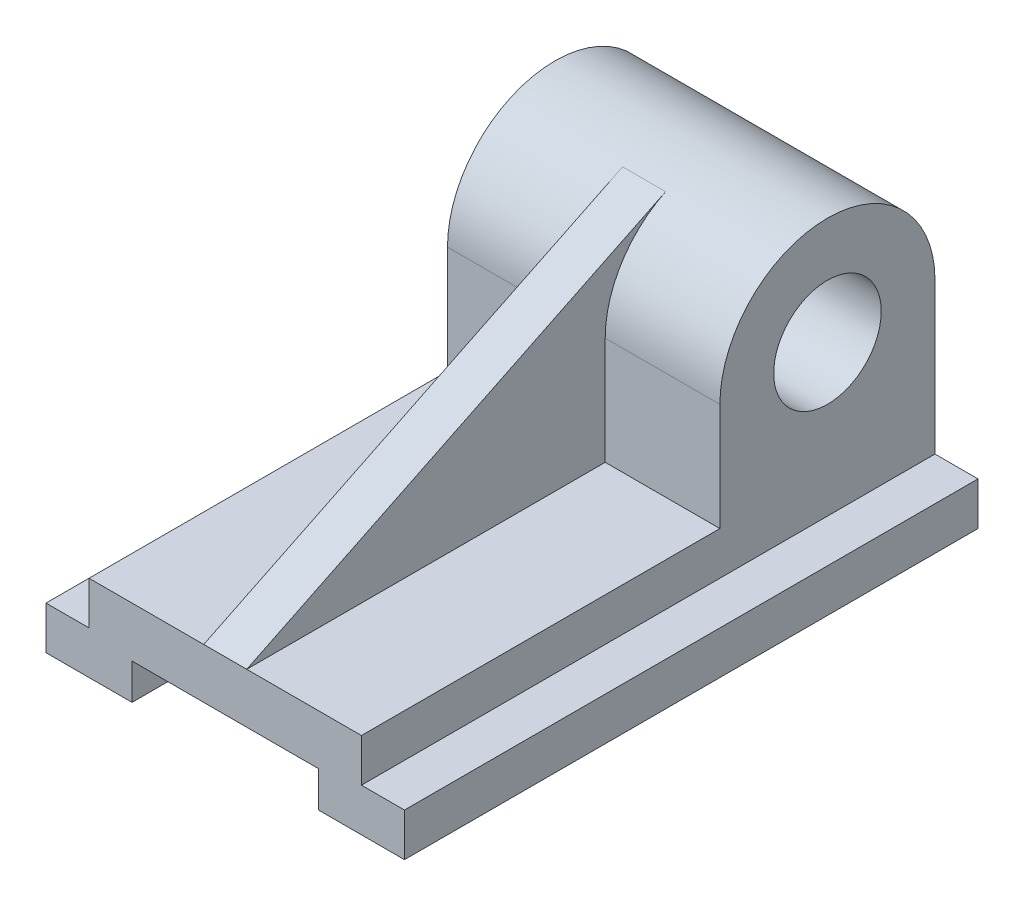
ISO-10303-21;
HEADER;
FILE_DESCRIPTION(('STEP AP214'),'2;1');
FILE_NAME('part.step','',(''),(''),'','','');
FILE_SCHEMA(('AUTOMOTIVE_DESIGN { 1 0 10303 214 1 1 1 1 }'));
ENDSEC;
DATA;
#1=APPLICATION_CONTEXT('core data for automotive mechanical design processes');
#2=APPLICATION_PROTOCOL_DEFINITION('international standard','automotive_design',2000,#1);
#3=PRODUCT_CONTEXT('',#1,'mechanical');
#4=PRODUCT('Part','Part','',(#3));
#5=PRODUCT_RELATED_PRODUCT_CATEGORY('part','',(#4));
#6=PRODUCT_DEFINITION_FORMATION('','',#4);
#7=PRODUCT_DEFINITION_CONTEXT('part definition',#1,'design');
#8=PRODUCT_DEFINITION('design','',#6,#7);
#9=PRODUCT_DEFINITION_SHAPE('','',#8);
#10=(LENGTH_UNIT() NAMED_UNIT(*) SI_UNIT(.MILLI.,.METRE.));
#11=(NAMED_UNIT(*) PLANE_ANGLE_UNIT() SI_UNIT($,.RADIAN.));
#12=(NAMED_UNIT(*) SI_UNIT($,.STERADIAN.) SOLID_ANGLE_UNIT());
#13=UNCERTAINTY_MEASURE_WITH_UNIT(LENGTH_MEASURE(1.E-05),#10,'distance_accuracy_value','');
#14=(GEOMETRIC_REPRESENTATION_CONTEXT(3) GLOBAL_UNCERTAINTY_ASSIGNED_CONTEXT((#13)) GLOBAL_UNIT_ASSIGNED_CONTEXT((#10,
#11,#12)) REPRESENTATION_CONTEXT('',''));
#15=CARTESIAN_POINT('',(0.,0.,0.));
#16=DIRECTION('',(0.,0.,1.));
#17=DIRECTION('',(1.,0.,0.));
#18=AXIS2_PLACEMENT_3D('',#15,#16,#17);
#19=CARTESIAN_POINT('',(-50.,12.,160.));
#20=DIRECTION('',(0.,-1.,0.));
#21=DIRECTION('',(0.,0.,-1.));
#22=AXIS2_PLACEMENT_3D('',#19,#20,#21);
#23=PLANE('',#22);
#24=DIRECTION('',(0.,0.,1.));
#25=VECTOR('',#24,1.);
#26=CARTESIAN_POINT('',(-6.,12.,160.));
#27=LINE('',#26,#25);
#28=CARTESIAN_POINT('',(-6.,12.,60.));
#29=VERTEX_POINT('',#28);
#30=CARTESIAN_POINT('',(-6.,12.,160.));
#31=VERTEX_POINT('',#30);
#32=EDGE_CURVE('E185',#29,#31,#27,.T.);
#33=ORIENTED_EDGE('',*,*,#32,.F.);
#34=DIRECTION('',(1.,0.,0.));
#35=VECTOR('',#34,1.);
#36=CARTESIAN_POINT('',(-38.,12.,60.));
#37=LINE('',#36,#35);
#38=CARTESIAN_POINT('',(-38.,12.,60.));
#39=VERTEX_POINT('',#38);
#40=EDGE_CURVE('E170',#39,#29,#37,.T.);
#41=ORIENTED_EDGE('',*,*,#40,.F.);
#42=DIRECTION('',(0.,0.,1.));
#43=VECTOR('',#42,1.);
#44=CARTESIAN_POINT('',(-38.,12.,0.));
#45=LINE('',#44,#43);
#46=CARTESIAN_POINT('',(-38.,12.,160.));
#47=VERTEX_POINT('',#46);
#48=EDGE_CURVE('E241',#39,#47,#45,.T.);
#49=ORIENTED_EDGE('',*,*,#48,.T.);
#50=DIRECTION('',(-1.,0.,0.));
#51=VECTOR('',#50,1.);
#52=CARTESIAN_POINT('',(-50.,12.,160.));
#53=LINE('',#52,#51);
#54=EDGE_CURVE('E186',#31,#47,#53,.T.);
#55=ORIENTED_EDGE('',*,*,#54,.F.);
#56=EDGE_LOOP('',(#33,#41,#49,#55));
#57=FACE_BOUND('',#56,.T.);
#58=ADVANCED_FACE('F45',(#57),#23,.F.);
#59=CARTESIAN_POINT('',(-38.,72.,60.));
#60=DIRECTION('',(0.,0.,-1.));
#61=DIRECTION('',(-1.,0.,0.));
#62=AXIS2_PLACEMENT_3D('',#59,#60,#61);
#63=PLANE('',#62);
#64=DIRECTION('',(0.,-1.,0.));
#65=VECTOR('',#64,1.);
#66=CARTESIAN_POINT('',(-6.,72.,60.));
#67=LINE('',#66,#65);
#68=CARTESIAN_POINT('',(-6.,42.,60.));
#69=VERTEX_POINT('',#68);
#70=EDGE_CURVE('E174',#69,#29,#67,.T.);
#71=ORIENTED_EDGE('',*,*,#70,.F.);
#72=DIRECTION('',(-1.,0.,0.));
#73=VECTOR('',#72,1.);
#74=CARTESIAN_POINT('',(38.,42.,60.));
#75=LINE('',#74,#73);
#76=CARTESIAN_POINT('',(-38.,42.,60.));
#77=VERTEX_POINT('',#76);
#78=EDGE_CURVE('E346',#69,#77,#75,.T.);
#79=ORIENTED_EDGE('',*,*,#78,.T.);
#80=DIRECTION('',(0.,-1.,0.));
#81=VECTOR('',#80,1.);
#82=CARTESIAN_POINT('',(-38.,72.,60.));
#83=LINE('',#82,#81);
#84=EDGE_CURVE('E176',#77,#39,#83,.T.);
#85=ORIENTED_EDGE('',*,*,#84,.T.);
#86=ORIENTED_EDGE('',*,*,#40,.T.);
#87=EDGE_LOOP('',(#71,#79,#85,#86));
#88=FACE_BOUND('',#87,.T.);
#89=ADVANCED_FACE('F172',(#88),#63,.F.);
#90=CARTESIAN_POINT('',(38.,42.,30.));
#91=DIRECTION('',(1.,0.,0.));
#92=DIRECTION('',(0.,0.,-1.));
#93=AXIS2_PLACEMENT_3D('',#90,#91,#92);
#94=CYLINDRICAL_SURFACE('',#93,30.);
#95=CARTESIAN_POINT('',(38.,42.,30.));
#96=DIRECTION('',(-1.,0.,0.));
#97=DIRECTION('',(0.,0.,1.));
#98=AXIS2_PLACEMENT_3D('',#95,#96,#97);
#99=CIRCLE('',#98,30.);
#100=CARTESIAN_POINT('',(38.,42.,0.));
#101=VERTEX_POINT('',#100);
#102=CARTESIAN_POINT('',(38.,42.,60.));
#103=VERTEX_POINT('',#102);
#104=EDGE_CURVE('E56',#101,#103,#99,.F.);
#105=ORIENTED_EDGE('',*,*,#104,.F.);
#106=DIRECTION('',(-1.,0.,0.));
#107=VECTOR('',#106,1.);
#108=CARTESIAN_POINT('',(38.,42.,0.));
#109=LINE('',#108,#107);
#110=CARTESIAN_POINT('',(-38.,42.,0.));
#111=VERTEX_POINT('',#110);
#112=EDGE_CURVE('E351',#111,#101,#109,.F.);
#113=ORIENTED_EDGE('',*,*,#112,.F.);
#114=CARTESIAN_POINT('',(-38.,42.,30.));
#115=DIRECTION('',(-1.,0.,0.));
#116=DIRECTION('',(0.,0.,1.));
#117=AXIS2_PLACEMENT_3D('',#114,#115,#116);
#118=CIRCLE('',#117,30.);
#119=EDGE_CURVE('E11',#77,#111,#118,.T.);
#120=ORIENTED_EDGE('',*,*,#119,.F.);
#121=ORIENTED_EDGE('',*,*,#78,.F.);
#122=CARTESIAN_POINT('',(-6.,42.,30.));
#123=DIRECTION('',(1.,0.,0.));
#124=DIRECTION('',(0.,0.,-1.));
#125=AXIS2_PLACEMENT_3D('',#122,#123,#124);
#126=CIRCLE('',#125,30.);
#127=CARTESIAN_POINT('',(-6.,68.9662921348059,43.1460674157097));
#128=VERTEX_POINT('',#127);
#129=EDGE_CURVE('E68',#69,#128,#126,.F.);
#130=ORIENTED_EDGE('',*,*,#129,.T.);
#131=DIRECTION('',(1.,0.,0.));
#132=VECTOR('',#131,1.);
#133=CARTESIAN_POINT('',(38.,68.9662921348203,43.1460674157167));
#134=LINE('',#133,#132);
#135=CARTESIAN_POINT('',(6.,68.9662921348059,43.1460674157097));
#136=VERTEX_POINT('',#135);
#137=EDGE_CURVE('E63',#128,#136,#134,.T.);
#138=ORIENTED_EDGE('',*,*,#137,.T.);
#139=CARTESIAN_POINT('',(6.,42.,30.));
#140=DIRECTION('',(1.,0.,0.));
#141=DIRECTION('',(0.,0.,-1.));
#142=AXIS2_PLACEMENT_3D('',#139,#140,#141);
#143=CIRCLE('',#142,30.);
#144=CARTESIAN_POINT('',(6.,42.,60.));
#145=VERTEX_POINT('',#144);
#146=EDGE_CURVE('E211',#145,#136,#143,.F.);
#147=ORIENTED_EDGE('',*,*,#146,.F.);
#148=EDGE_CURVE('E347',#103,#145,#75,.T.);
#149=ORIENTED_EDGE('',*,*,#148,.F.);
#150=EDGE_LOOP('',(#105,#113,#120,#121,#130,#138,#147,#149));
#151=FACE_BOUND('',#150,.T.);
#152=ADVANCED_FACE('F48',(#151),#94,.T.);
#153=CARTESIAN_POINT('',(6.,12.,60.));
#154=VERTEX_POINT('',#153);
#155=CARTESIAN_POINT('',(38.,12.,60.));
#156=VERTEX_POINT('',#155);
#157=EDGE_CURVE('E182',#154,#156,#37,.T.);
#158=ORIENTED_EDGE('',*,*,#157,.F.);
#159=DIRECTION('',(0.,0.,1.));
#160=VECTOR('',#159,1.);
#161=CARTESIAN_POINT('',(6.,12.,160.));
#162=LINE('',#161,#160);
#163=CARTESIAN_POINT('',(6.,12.,160.));
#164=VERTEX_POINT('',#163);
#165=EDGE_CURVE('E208',#154,#164,#162,.T.);
#166=ORIENTED_EDGE('',*,*,#165,.T.);
#167=CARTESIAN_POINT('',(38.,12.,160.));
#168=VERTEX_POINT('',#167);
#169=EDGE_CURVE('E315',#168,#164,#53,.T.);
#170=ORIENTED_EDGE('',*,*,#169,.F.);
#171=DIRECTION('',(0.,0.,1.));
#172=VECTOR('',#171,1.);
#173=CARTESIAN_POINT('',(38.,12.,0.));
#174=LINE('',#173,#172);
#175=EDGE_CURVE('E258',#156,#168,#174,.T.);
#176=ORIENTED_EDGE('',*,*,#175,.F.);
#177=EDGE_LOOP('',(#158,#166,#170,#176));
#178=FACE_BOUND('',#177,.T.);
#179=ADVANCED_FACE('F434',(#178),#23,.F.);
#180=CARTESIAN_POINT('',(0.,0.,160.));
#181=DIRECTION('',(0.,0.,1.));
#182=DIRECTION('',(1.,0.,0.));
#183=AXIS2_PLACEMENT_3D('',#180,#181,#182);
#184=PLANE('',#183);
#185=ORIENTED_EDGE('',*,*,#169,.T.);
#186=EDGE_CURVE('E320',#164,#31,#53,.T.);
#187=ORIENTED_EDGE('',*,*,#186,.T.);
#188=ORIENTED_EDGE('',*,*,#54,.T.);
#189=DIRECTION('',(0.,-1.,0.));
#190=VECTOR('',#189,1.);
#191=CARTESIAN_POINT('',(-38.,12.,160.));
#192=LINE('',#191,#190);
#193=CARTESIAN_POINT('',(-38.,0.,160.));
#194=VERTEX_POINT('',#193);
#195=EDGE_CURVE('E231',#47,#194,#192,.T.);
#196=ORIENTED_EDGE('',*,*,#195,.T.);
#197=DIRECTION('',(1.,0.,0.));
#198=VECTOR('',#197,1.);
#199=CARTESIAN_POINT('',(-50.,0.,160.));
#200=LINE('',#199,#198);
#201=CARTESIAN_POINT('',(-50.,0.,160.));
#202=VERTEX_POINT('',#201);
#203=EDGE_CURVE('E225',#202,#194,#200,.T.);
#204=ORIENTED_EDGE('',*,*,#203,.F.);
#205=DIRECTION('',(0.,-1.,0.));
#206=VECTOR('',#205,1.);
#207=CARTESIAN_POINT('',(-50.,12.,160.));
#208=LINE('',#207,#206);
#209=CARTESIAN_POINT('',(-50.,-12.,160.));
#210=VERTEX_POINT('',#209);
#211=EDGE_CURVE('E319',#202,#210,#208,.T.);
#212=ORIENTED_EDGE('',*,*,#211,.T.);
#213=DIRECTION('',(1.,0.,0.));
#214=VECTOR('',#213,1.);
#215=CARTESIAN_POINT('',(-50.,-12.,160.));
#216=LINE('',#215,#214);
#217=CARTESIAN_POINT('',(-26.,-12.,160.));
#218=VERTEX_POINT('',#217);
#219=EDGE_CURVE('E324',#210,#218,#216,.T.);
#220=ORIENTED_EDGE('',*,*,#219,.T.);
#221=DIRECTION('',(0.,-1.,0.));
#222=VECTOR('',#221,1.);
#223=CARTESIAN_POINT('',(-26.,-12.,160.));
#224=LINE('',#223,#222);
#225=CARTESIAN_POINT('',(-26.,-2.,160.));
#226=VERTEX_POINT('',#225);
#227=EDGE_CURVE('E269',#226,#218,#224,.T.);
#228=ORIENTED_EDGE('',*,*,#227,.F.);
#229=DIRECTION('',(-1.,0.,0.));
#230=VECTOR('',#229,1.);
#231=CARTESIAN_POINT('',(-26.,-2.,160.));
#232=LINE('',#231,#230);
#233=CARTESIAN_POINT('',(26.,-2.,160.));
#234=VERTEX_POINT('',#233);
#235=EDGE_CURVE('E280',#234,#226,#232,.T.);
#236=ORIENTED_EDGE('',*,*,#235,.F.);
#237=DIRECTION('',(0.,1.,0.));
#238=VECTOR('',#237,1.);
#239=CARTESIAN_POINT('',(26.,-12.,160.));
#240=LINE('',#239,#238);
#241=CARTESIAN_POINT('',(26.,-12.,160.));
#242=VERTEX_POINT('',#241);
#243=EDGE_CURVE('E290',#242,#234,#240,.T.);
#244=ORIENTED_EDGE('',*,*,#243,.F.);
#245=CARTESIAN_POINT('',(50.,-12.,160.));
#246=VERTEX_POINT('',#245);
#247=EDGE_CURVE('E323',#242,#246,#216,.T.);
#248=ORIENTED_EDGE('',*,*,#247,.T.);
#249=DIRECTION('',(0.,1.,0.));
#250=VECTOR('',#249,1.);
#251=CARTESIAN_POINT('',(50.,12.,160.));
#252=LINE('',#251,#250);
#253=CARTESIAN_POINT('',(50.,0.,160.));
#254=VERTEX_POINT('',#253);
#255=EDGE_CURVE('E310',#246,#254,#252,.T.);
#256=ORIENTED_EDGE('',*,*,#255,.T.);
#257=DIRECTION('',(-1.,0.,0.));
#258=VECTOR('',#257,1.);
#259=CARTESIAN_POINT('',(50.,0.,160.));
#260=LINE('',#259,#258);
#261=CARTESIAN_POINT('',(38.,0.,160.));
#262=VERTEX_POINT('',#261);
#263=EDGE_CURVE('E254',#254,#262,#260,.T.);
#264=ORIENTED_EDGE('',*,*,#263,.T.);
#265=DIRECTION('',(0.,-1.,0.));
#266=VECTOR('',#265,1.);
#267=CARTESIAN_POINT('',(38.,12.,160.));
#268=LINE('',#267,#266);
#269=EDGE_CURVE('E244',#168,#262,#268,.T.);
#270=ORIENTED_EDGE('',*,*,#269,.F.);
#271=EDGE_LOOP('',(#185,#187,#188,#196,#204,#212,#220,#228,#236,#244,#248,#256,#264,#270));
#272=FACE_BOUND('',#271,.T.);
#273=ADVANCED_FACE('F387',(#272),#184,.T.);
#274=CARTESIAN_POINT('',(0.,0.,0.));
#275=DIRECTION('',(0.,0.,1.));
#276=DIRECTION('',(1.,0.,0.));
#277=AXIS2_PLACEMENT_3D('',#274,#275,#276);
#278=PLANE('',#277);
#279=DIRECTION('',(-1.,0.,0.));
#280=VECTOR('',#279,1.);
#281=CARTESIAN_POINT('',(-26.,-2.,0.));
#282=LINE('',#281,#280);
#283=CARTESIAN_POINT('',(26.,-2.,0.));
#284=VERTEX_POINT('',#283);
#285=CARTESIAN_POINT('',(-26.,-2.,0.));
#286=VERTEX_POINT('',#285);
#287=EDGE_CURVE('E284',#284,#286,#282,.T.);
#288=ORIENTED_EDGE('',*,*,#287,.T.);
#289=DIRECTION('',(0.,-1.,0.));
#290=VECTOR('',#289,1.);
#291=CARTESIAN_POINT('',(-26.,-12.,0.));
#292=LINE('',#291,#290);
#293=CARTESIAN_POINT('',(-26.,-12.,0.));
#294=VERTEX_POINT('',#293);
#295=EDGE_CURVE('E275',#286,#294,#292,.T.);
#296=ORIENTED_EDGE('',*,*,#295,.T.);
#297=DIRECTION('',(1.,0.,0.));
#298=VECTOR('',#297,1.);
#299=CARTESIAN_POINT('',(-50.,-12.,0.));
#300=LINE('',#299,#298);
#301=CARTESIAN_POINT('',(-50.,-12.,0.));
#302=VERTEX_POINT('',#301);
#303=EDGE_CURVE('E314',#302,#294,#300,.T.);
#304=ORIENTED_EDGE('',*,*,#303,.F.);
#305=DIRECTION('',(0.,-1.,0.));
#306=VECTOR('',#305,1.);
#307=CARTESIAN_POINT('',(-50.,12.,0.));
#308=LINE('',#307,#306);
#309=CARTESIAN_POINT('',(-50.,0.,0.));
#310=VERTEX_POINT('',#309);
#311=EDGE_CURVE('E332',#310,#302,#308,.T.);
#312=ORIENTED_EDGE('',*,*,#311,.F.);
#313=DIRECTION('',(1.,0.,0.));
#314=VECTOR('',#313,1.);
#315=CARTESIAN_POINT('',(-50.,0.,0.));
#316=LINE('',#315,#314);
#317=CARTESIAN_POINT('',(-38.,0.,0.));
#318=VERTEX_POINT('',#317);
#319=EDGE_CURVE('E226',#310,#318,#316,.T.);
#320=ORIENTED_EDGE('',*,*,#319,.T.);
#321=DIRECTION('',(0.,-1.,0.));
#322=VECTOR('',#321,1.);
#323=CARTESIAN_POINT('',(-38.,12.,0.));
#324=LINE('',#323,#322);
#325=EDGE_CURVE('E230',#111,#318,#324,.T.);
#326=ORIENTED_EDGE('',*,*,#325,.F.);
#327=ORIENTED_EDGE('',*,*,#112,.T.);
#328=DIRECTION('',(0.,-1.,0.));
#329=VECTOR('',#328,1.);
#330=CARTESIAN_POINT('',(38.,12.,0.));
#331=LINE('',#330,#329);
#332=CARTESIAN_POINT('',(38.,0.,0.));
#333=VERTEX_POINT('',#332);
#334=EDGE_CURVE('E250',#101,#333,#331,.T.);
#335=ORIENTED_EDGE('',*,*,#334,.T.);
#336=DIRECTION('',(-1.,0.,0.));
#337=VECTOR('',#336,1.);
#338=CARTESIAN_POINT('',(50.,0.,0.));
#339=LINE('',#338,#337);
#340=CARTESIAN_POINT('',(50.,0.,0.));
#341=VERTEX_POINT('',#340);
#342=EDGE_CURVE('E253',#341,#333,#339,.T.);
#343=ORIENTED_EDGE('',*,*,#342,.F.);
#344=DIRECTION('',(0.,1.,0.));
#345=VECTOR('',#344,1.);
#346=CARTESIAN_POINT('',(50.,12.,0.));
#347=LINE('',#346,#345);
#348=CARTESIAN_POINT('',(50.,-12.,0.));
#349=VERTEX_POINT('',#348);
#350=EDGE_CURVE('E300',#349,#341,#347,.T.);
#351=ORIENTED_EDGE('',*,*,#350,.F.);
#352=CARTESIAN_POINT('',(26.,-12.,0.));
#353=VERTEX_POINT('',#352);
#354=EDGE_CURVE('E335',#353,#349,#300,.T.);
#355=ORIENTED_EDGE('',*,*,#354,.F.);
#356=DIRECTION('',(0.,1.,0.));
#357=VECTOR('',#356,1.);
#358=CARTESIAN_POINT('',(26.,-12.,0.));
#359=LINE('',#358,#357);
#360=EDGE_CURVE('E279',#353,#284,#359,.T.);
#361=ORIENTED_EDGE('',*,*,#360,.T.);
#362=EDGE_LOOP('',(#288,#296,#304,#312,#320,#326,#327,#335,#343,#351,#355,#361));
#363=FACE_BOUND('',#362,.T.);
#364=ADVANCED_FACE('F396',(#363),#278,.F.);
#365=CARTESIAN_POINT('',(50.,12.,160.));
#366=DIRECTION('',(-1.,0.,0.));
#367=DIRECTION('',(0.,0.,1.));
#368=AXIS2_PLACEMENT_3D('',#365,#366,#367);
#369=PLANE('',#368);
#370=DIRECTION('',(0.,0.,1.));
#371=VECTOR('',#370,1.);
#372=CARTESIAN_POINT('',(50.,0.,0.));
#373=LINE('',#372,#371);
#374=EDGE_CURVE('E265',#341,#254,#373,.T.);
#375=ORIENTED_EDGE('',*,*,#374,.T.);
#376=ORIENTED_EDGE('',*,*,#255,.F.);
#377=DIRECTION('',(0.,0.,-1.));
#378=VECTOR('',#377,1.);
#379=CARTESIAN_POINT('',(50.,-12.,160.));
#380=LINE('',#379,#378);
#381=EDGE_CURVE('E328',#246,#349,#380,.T.);
#382=ORIENTED_EDGE('',*,*,#381,.T.);
#383=ORIENTED_EDGE('',*,*,#350,.T.);
#384=EDGE_LOOP('',(#375,#376,#382,#383));
#385=FACE_BOUND('',#384,.T.);
#386=ADVANCED_FACE('F428',(#385),#369,.F.);
#387=CARTESIAN_POINT('',(-50.,-12.,160.));
#388=DIRECTION('',(0.,1.,0.));
#389=DIRECTION('',(0.,0.,1.));
#390=AXIS2_PLACEMENT_3D('',#387,#388,#389);
#391=PLANE('',#390);
#392=ORIENTED_EDGE('',*,*,#303,.T.);
#393=DIRECTION('',(0.,0.,1.));
#394=VECTOR('',#393,1.);
#395=CARTESIAN_POINT('',(-26.,-12.,0.));
#396=LINE('',#395,#394);
#397=EDGE_CURVE('E287',#294,#218,#396,.T.);
#398=ORIENTED_EDGE('',*,*,#397,.T.);
#399=ORIENTED_EDGE('',*,*,#219,.F.);
#400=DIRECTION('',(0.,0.,-1.));
#401=VECTOR('',#400,1.);
#402=CARTESIAN_POINT('',(-50.,-12.,160.));
#403=LINE('',#402,#401);
#404=EDGE_CURVE('E342',#210,#302,#403,.T.);
#405=ORIENTED_EDGE('',*,*,#404,.T.);
#406=EDGE_LOOP('',(#392,#398,#399,#405));
#407=FACE_BOUND('',#406,.T.);
#408=ADVANCED_FACE('F406',(#407),#391,.F.);
#409=CARTESIAN_POINT('',(-50.,12.,160.));
#410=DIRECTION('',(1.,0.,0.));
#411=DIRECTION('',(0.,0.,-1.));
#412=AXIS2_PLACEMENT_3D('',#409,#410,#411);
#413=PLANE('',#412);
#414=ORIENTED_EDGE('',*,*,#211,.F.);
#415=DIRECTION('',(0.,0.,1.));
#416=VECTOR('',#415,1.);
#417=CARTESIAN_POINT('',(-50.,0.,0.));
#418=LINE('',#417,#416);
#419=EDGE_CURVE('E234',#310,#202,#418,.T.);
#420=ORIENTED_EDGE('',*,*,#419,.F.);
#421=ORIENTED_EDGE('',*,*,#311,.T.);
#422=ORIENTED_EDGE('',*,*,#404,.F.);
#423=EDGE_LOOP('',(#414,#420,#421,#422));
#424=FACE_BOUND('',#423,.T.);
#425=ADVANCED_FACE('F401',(#424),#413,.F.);
#426=ORIENTED_EDGE('',*,*,#247,.F.);
#427=DIRECTION('',(0.,0.,1.));
#428=VECTOR('',#427,1.);
#429=CARTESIAN_POINT('',(26.,-12.,0.));
#430=LINE('',#429,#428);
#431=EDGE_CURVE('E304',#353,#242,#430,.T.);
#432=ORIENTED_EDGE('',*,*,#431,.F.);
#433=ORIENTED_EDGE('',*,*,#354,.T.);
#434=ORIENTED_EDGE('',*,*,#381,.F.);
#435=EDGE_LOOP('',(#426,#432,#433,#434));
#436=FACE_BOUND('',#435,.T.);
#437=ADVANCED_FACE('F423',(#436),#391,.F.);
#438=CARTESIAN_POINT('',(-26.,-12.,0.));
#439=DIRECTION('',(-1.,0.,0.));
#440=DIRECTION('',(0.,0.,1.));
#441=AXIS2_PLACEMENT_3D('',#438,#439,#440);
#442=PLANE('',#441);
#443=ORIENTED_EDGE('',*,*,#227,.T.);
#444=ORIENTED_EDGE('',*,*,#397,.F.);
#445=ORIENTED_EDGE('',*,*,#295,.F.);
#446=DIRECTION('',(0.,0.,1.));
#447=VECTOR('',#446,1.);
#448=CARTESIAN_POINT('',(-26.,-2.,0.));
#449=LINE('',#448,#447);
#450=EDGE_CURVE('E296',#286,#226,#449,.T.);
#451=ORIENTED_EDGE('',*,*,#450,.T.);
#452=EDGE_LOOP('',(#443,#444,#445,#451));
#453=FACE_BOUND('',#452,.T.);
#454=ADVANCED_FACE('F412',(#453),#442,.F.);
#455=CARTESIAN_POINT('',(-26.,-2.,0.));
#456=DIRECTION('',(0.,1.,0.));
#457=DIRECTION('',(0.,0.,1.));
#458=AXIS2_PLACEMENT_3D('',#455,#456,#457);
#459=PLANE('',#458);
#460=ORIENTED_EDGE('',*,*,#235,.T.);
#461=ORIENTED_EDGE('',*,*,#450,.F.);
#462=ORIENTED_EDGE('',*,*,#287,.F.);
#463=DIRECTION('',(0.,0.,1.));
#464=VECTOR('',#463,1.);
#465=CARTESIAN_POINT('',(26.,-2.,0.));
#466=LINE('',#465,#464);
#467=EDGE_CURVE('E301',#284,#234,#466,.T.);
#468=ORIENTED_EDGE('',*,*,#467,.T.);
#469=EDGE_LOOP('',(#460,#461,#462,#468));
#470=FACE_BOUND('',#469,.T.);
#471=ADVANCED_FACE('F415',(#470),#459,.F.);
#472=CARTESIAN_POINT('',(26.,-12.,0.));
#473=DIRECTION('',(1.,0.,0.));
#474=DIRECTION('',(0.,0.,-1.));
#475=AXIS2_PLACEMENT_3D('',#472,#473,#474);
#476=PLANE('',#475);
#477=ORIENTED_EDGE('',*,*,#243,.T.);
#478=ORIENTED_EDGE('',*,*,#467,.F.);
#479=ORIENTED_EDGE('',*,*,#360,.F.);
#480=ORIENTED_EDGE('',*,*,#431,.T.);
#481=EDGE_LOOP('',(#477,#478,#479,#480));
#482=FACE_BOUND('',#481,.T.);
#483=ADVANCED_FACE('F418',(#482),#476,.F.);
#484=CARTESIAN_POINT('',(50.,0.,0.));
#485=DIRECTION('',(0.,1.,0.));
#486=DIRECTION('',(-1.,0.,0.));
#487=AXIS2_PLACEMENT_3D('',#484,#485,#486);
#488=PLANE('',#487);
#489=ORIENTED_EDGE('',*,*,#263,.F.);
#490=ORIENTED_EDGE('',*,*,#374,.F.);
#491=ORIENTED_EDGE('',*,*,#342,.T.);
#492=DIRECTION('',(0.,0.,1.));
#493=VECTOR('',#492,1.);
#494=CARTESIAN_POINT('',(38.,0.,0.));
#495=LINE('',#494,#493);
#496=EDGE_CURVE('E270',#333,#262,#495,.T.);
#497=ORIENTED_EDGE('',*,*,#496,.T.);
#498=EDGE_LOOP('',(#489,#490,#491,#497));
#499=FACE_BOUND('',#498,.T.);
#500=ADVANCED_FACE('F432',(#499),#488,.T.);
#501=CARTESIAN_POINT('',(38.,12.,0.));
#502=DIRECTION('',(-1.,0.,0.));
#503=DIRECTION('',(0.,0.,1.));
#504=AXIS2_PLACEMENT_3D('',#501,#502,#503);
#505=PLANE('',#504);
#506=CARTESIAN_POINT('',(38.,42.,30.));
#507=DIRECTION('',(1.,0.,0.));
#508=DIRECTION('',(0.,0.,-1.));
#509=AXIS2_PLACEMENT_3D('',#506,#507,#508);
#510=CIRCLE('',#509,15.);
#511=CARTESIAN_POINT('',(38.,42.,15.));
#512=VERTEX_POINT('',#511);
#513=EDGE_CURVE('E216',#512,#512,#510,.T.);
#514=ORIENTED_EDGE('',*,*,#513,.F.);
#515=EDGE_LOOP('',(#514));
#516=FACE_BOUND('',#515,.T.);
#517=ORIENTED_EDGE('',*,*,#334,.F.);
#518=ORIENTED_EDGE('',*,*,#104,.T.);
#519=DIRECTION('',(0.,-1.,0.));
#520=VECTOR('',#519,1.);
#521=CARTESIAN_POINT('',(38.,72.,60.));
#522=LINE('',#521,#520);
#523=EDGE_CURVE('E181',#103,#156,#522,.T.);
#524=ORIENTED_EDGE('',*,*,#523,.T.);
#525=ORIENTED_EDGE('',*,*,#175,.T.);
#526=ORIENTED_EDGE('',*,*,#269,.T.);
#527=ORIENTED_EDGE('',*,*,#496,.F.);
#528=EDGE_LOOP('',(#517,#518,#524,#525,#526,#527));
#529=FACE_BOUND('',#528,.T.);
#530=ADVANCED_FACE('F359',(#516,#529),#505,.F.);
#531=CARTESIAN_POINT('',(-38.,12.,0.));
#532=DIRECTION('',(-1.,0.,0.));
#533=DIRECTION('',(0.,0.,1.));
#534=AXIS2_PLACEMENT_3D('',#531,#532,#533);
#535=PLANE('',#534);
#536=CARTESIAN_POINT('',(-38.,42.,30.));
#537=DIRECTION('',(-1.,0.,0.));
#538=DIRECTION('',(0.,0.,1.));
#539=AXIS2_PLACEMENT_3D('',#536,#537,#538);
#540=CIRCLE('',#539,15.);
#541=CARTESIAN_POINT('',(-38.,42.,45.));
#542=VERTEX_POINT('',#541);
#543=EDGE_CURVE('E50',#542,#542,#540,.T.);
#544=ORIENTED_EDGE('',*,*,#543,.F.);
#545=EDGE_LOOP('',(#544));
#546=FACE_BOUND('',#545,.T.);
#547=ORIENTED_EDGE('',*,*,#84,.F.);
#548=ORIENTED_EDGE('',*,*,#119,.T.);
#549=ORIENTED_EDGE('',*,*,#325,.T.);
#550=DIRECTION('',(0.,0.,1.));
#551=VECTOR('',#550,1.);
#552=CARTESIAN_POINT('',(-38.,0.,0.));
#553=LINE('',#552,#551);
#554=EDGE_CURVE('E245',#318,#194,#553,.T.);
#555=ORIENTED_EDGE('',*,*,#554,.T.);
#556=ORIENTED_EDGE('',*,*,#195,.F.);
#557=ORIENTED_EDGE('',*,*,#48,.F.);
#558=EDGE_LOOP('',(#547,#548,#549,#555,#556,#557));
#559=FACE_BOUND('',#558,.T.);
#560=ADVANCED_FACE('F377',(#546,#559),#535,.T.);
#561=CARTESIAN_POINT('',(-50.,0.,0.));
#562=DIRECTION('',(0.,-1.,0.));
#563=DIRECTION('',(1.,0.,0.));
#564=AXIS2_PLACEMENT_3D('',#561,#562,#563);
#565=PLANE('',#564);
#566=ORIENTED_EDGE('',*,*,#203,.T.);
#567=ORIENTED_EDGE('',*,*,#554,.F.);
#568=ORIENTED_EDGE('',*,*,#319,.F.);
#569=ORIENTED_EDGE('',*,*,#419,.T.);
#570=EDGE_LOOP('',(#566,#567,#568,#569));
#571=FACE_BOUND('',#570,.T.);
#572=ADVANCED_FACE('F380',(#571),#565,.F.);
#573=ORIENTED_EDGE('',*,*,#148,.T.);
#574=DIRECTION('',(0.,-1.,0.));
#575=VECTOR('',#574,1.);
#576=CARTESIAN_POINT('',(6.,72.,60.));
#577=LINE('',#576,#575);
#578=EDGE_CURVE('E205',#145,#154,#577,.T.);
#579=ORIENTED_EDGE('',*,*,#578,.T.);
#580=ORIENTED_EDGE('',*,*,#157,.T.);
#581=ORIENTED_EDGE('',*,*,#523,.F.);
#582=EDGE_LOOP('',(#573,#579,#580,#581));
#583=FACE_BOUND('',#582,.T.);
#584=ADVANCED_FACE('F366',(#583),#63,.F.);
#585=CARTESIAN_POINT('',(-50.,42.,30.));
#586=DIRECTION('',(1.,0.,0.));
#587=DIRECTION('',(0.,0.,-1.));
#588=AXIS2_PLACEMENT_3D('',#585,#586,#587);
#589=CYLINDRICAL_SURFACE('',#588,15.);
#590=ORIENTED_EDGE('',*,*,#513,.T.);
#591=EDGE_LOOP('',(#590));
#592=FACE_BOUND('',#591,.T.);
#593=ORIENTED_EDGE('',*,*,#543,.T.);
#594=EDGE_LOOP('',(#593));
#595=FACE_BOUND('',#594,.T.);
#596=ADVANCED_FACE('F375',(#592,#595),#589,.F.);
#597=CARTESIAN_POINT('',(0.,12.,160.));
#598=DIRECTION('',(0.,-0.89887640449449,-0.43820224719079));
#599=DIRECTION('',(0.,0.43820224719079,-0.89887640449449));
#600=AXIS2_PLACEMENT_3D('',#597,#598,#599);
#601=PLANE('',#600);
#602=ORIENTED_EDGE('',*,*,#137,.F.);
#603=DIRECTION('',(0.,0.43820224719079,-0.89887640449449));
#604=VECTOR('',#603,1.);
#605=CARTESIAN_POINT('',(-6.,12.,160.));
#606=LINE('',#605,#604);
#607=EDGE_CURVE('E199',#31,#128,#606,.T.);
#608=ORIENTED_EDGE('',*,*,#607,.F.);
#609=ORIENTED_EDGE('',*,*,#186,.F.);
#610=DIRECTION('',(0.,0.43820224719079,-0.89887640449449));
#611=VECTOR('',#610,1.);
#612=CARTESIAN_POINT('',(6.,12.,160.));
#613=LINE('',#612,#611);
#614=EDGE_CURVE('E195',#164,#136,#613,.T.);
#615=ORIENTED_EDGE('',*,*,#614,.T.);
#616=EDGE_LOOP('',(#602,#608,#609,#615));
#617=FACE_BOUND('',#616,.T.);
#618=ADVANCED_FACE('F437',(#617),#601,.F.);
#619=CARTESIAN_POINT('',(6.,30.,80.));
#620=DIRECTION('',(1.,0.,0.));
#621=DIRECTION('',(0.,0.,-1.));
#622=AXIS2_PLACEMENT_3D('',#619,#620,#621);
#623=PLANE('',#622);
#624=ORIENTED_EDGE('',*,*,#578,.F.);
#625=ORIENTED_EDGE('',*,*,#146,.T.);
#626=ORIENTED_EDGE('',*,*,#614,.F.);
#627=ORIENTED_EDGE('',*,*,#165,.F.);
#628=EDGE_LOOP('',(#624,#625,#626,#627));
#629=FACE_BOUND('',#628,.T.);
#630=ADVANCED_FACE('F439',(#629),#623,.T.);
#631=CARTESIAN_POINT('',(-6.,30.,80.));
#632=DIRECTION('',(1.,0.,0.));
#633=DIRECTION('',(0.,0.,-1.));
#634=AXIS2_PLACEMENT_3D('',#631,#632,#633);
#635=PLANE('',#634);
#636=ORIENTED_EDGE('',*,*,#129,.F.);
#637=ORIENTED_EDGE('',*,*,#70,.T.);
#638=ORIENTED_EDGE('',*,*,#32,.T.);
#639=ORIENTED_EDGE('',*,*,#607,.T.);
#640=EDGE_LOOP('',(#636,#637,#638,#639));
#641=FACE_BOUND('',#640,.T.);
#642=ADVANCED_FACE('F193',(#641),#635,.F.);
#643=CLOSED_SHELL('',(#58,#89,#152,#179,#273,#364,#386,#408,#425,#437,#454,#471,#483,#500,#530,
#560,#572,#584,#596,#618,#630,#642));
#644=MANIFOLD_SOLID_BREP('B2',#643);
#645=ADVANCED_BREP_SHAPE_REPRESENTATION('',(#18,#644),#14);
#646=SHAPE_DEFINITION_REPRESENTATION(#9,#645);
ENDSEC;
END-ISO-10303-21;
